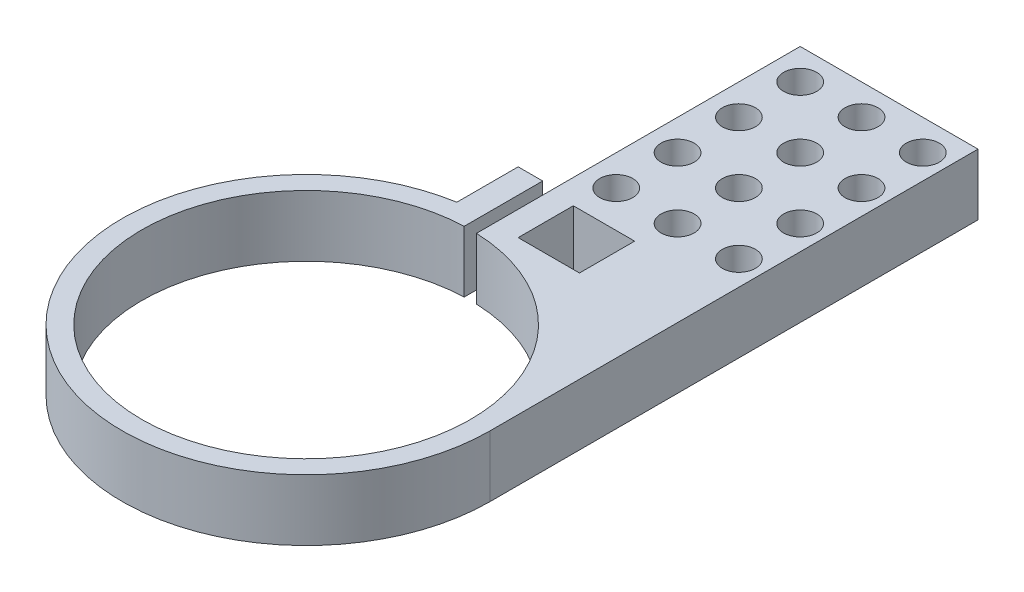
ISO-10303-21;
HEADER;
FILE_DESCRIPTION(('STEP AP214'),'2;1');
FILE_NAME('part.step','',(''),(''),'','','');
FILE_SCHEMA(('AUTOMOTIVE_DESIGN { 1 0 10303 214 1 1 1 1 }'));
ENDSEC;
DATA;
#1=APPLICATION_CONTEXT('core data for automotive mechanical design processes');
#2=APPLICATION_PROTOCOL_DEFINITION('international standard','automotive_design',2000,#1);
#3=PRODUCT_CONTEXT('',#1,'mechanical');
#4=PRODUCT('Part','Part','',(#3));
#5=PRODUCT_RELATED_PRODUCT_CATEGORY('part','',(#4));
#6=PRODUCT_DEFINITION_FORMATION('','',#4);
#7=PRODUCT_DEFINITION_CONTEXT('part definition',#1,'design');
#8=PRODUCT_DEFINITION('design','',#6,#7);
#9=PRODUCT_DEFINITION_SHAPE('','',#8);
#10=(LENGTH_UNIT() NAMED_UNIT(*) SI_UNIT(.MILLI.,.METRE.));
#11=(NAMED_UNIT(*) PLANE_ANGLE_UNIT() SI_UNIT($,.RADIAN.));
#12=(NAMED_UNIT(*) SI_UNIT($,.STERADIAN.) SOLID_ANGLE_UNIT());
#13=UNCERTAINTY_MEASURE_WITH_UNIT(LENGTH_MEASURE(1.E-05),#10,'distance_accuracy_value','');
#14=(GEOMETRIC_REPRESENTATION_CONTEXT(3) GLOBAL_UNCERTAINTY_ASSIGNED_CONTEXT((#13)) GLOBAL_UNIT_ASSIGNED_CONTEXT((#10,
#11,#12)) REPRESENTATION_CONTEXT('',''));
#15=CARTESIAN_POINT('',(0.,0.,0.));
#16=DIRECTION('',(0.,0.,1.));
#17=DIRECTION('',(1.,0.,0.));
#18=AXIS2_PLACEMENT_3D('',#15,#16,#17);
#19=CARTESIAN_POINT('',(0.,12.7,0.));
#20=DIRECTION('',(0.,-1.,0.));
#21=DIRECTION('',(0.,0.,-1.));
#22=AXIS2_PLACEMENT_3D('',#19,#20,#21);
#23=CYLINDRICAL_SURFACE('',#22,38.1);
#24=DIRECTION('',(0.,-1.,0.));
#25=VECTOR('',#24,1.);
#26=CARTESIAN_POINT('',(38.1,12.7,0.));
#27=LINE('',#26,#25);
#28=CARTESIAN_POINT('',(38.1,12.7,0.));
#29=VERTEX_POINT('',#28);
#30=CARTESIAN_POINT('',(38.1,0.,0.));
#31=VERTEX_POINT('',#30);
#32=EDGE_CURVE('E187',#29,#31,#27,.T.);
#33=ORIENTED_EDGE('',*,*,#32,.F.);
#34=CARTESIAN_POINT('',(0.,12.7,0.));
#35=DIRECTION('',(0.,1.,0.));
#36=DIRECTION('',(0.,0.,1.));
#37=AXIS2_PLACEMENT_3D('',#34,#35,#36);
#38=CIRCLE('',#37,38.1);
#39=CARTESIAN_POINT('',(-6.35000000000001,12.7,-37.5671066226826));
#40=VERTEX_POINT('',#39);
#41=EDGE_CURVE('E40',#40,#29,#38,.T.);
#42=ORIENTED_EDGE('',*,*,#41,.F.);
#43=DIRECTION('',(0.,-1.,0.));
#44=VECTOR('',#43,1.);
#45=CARTESIAN_POINT('',(-6.35,12.7,-37.5671066226826));
#46=LINE('',#45,#44);
#47=CARTESIAN_POINT('',(-6.35,0.,-37.5671066226826));
#48=VERTEX_POINT('',#47);
#49=EDGE_CURVE('E217',#40,#48,#46,.T.);
#50=ORIENTED_EDGE('',*,*,#49,.T.);
#51=CARTESIAN_POINT('',(0.,0.,0.));
#52=DIRECTION('',(0.,1.,0.));
#53=DIRECTION('',(0.,0.,1.));
#54=AXIS2_PLACEMENT_3D('',#51,#52,#53);
#55=CIRCLE('',#54,38.1);
#56=EDGE_CURVE('E224',#48,#31,#55,.T.);
#57=ORIENTED_EDGE('',*,*,#56,.T.);
#58=EDGE_LOOP('',(#33,#42,#50,#57));
#59=FACE_BOUND('',#58,.T.);
#60=ADVANCED_FACE('F33',(#59),#23,.T.);
#61=CARTESIAN_POINT('',(0.,12.7,0.));
#62=DIRECTION('',(0.,1.,0.));
#63=DIRECTION('',(0.,0.,1.));
#64=AXIS2_PLACEMENT_3D('',#61,#62,#63);
#65=PLANE('',#64);
#66=CARTESIAN_POINT('',(20.3200000000003,12.7,-69.3171066226826));
#67=DIRECTION('',(0.,1.,0.));
#68=DIRECTION('',(0.,0.,1.));
#69=AXIS2_PLACEMENT_3D('',#66,#67,#68);
#70=CIRCLE('',#69,3.42900000000002);
#71=CARTESIAN_POINT('',(20.3200000000003,12.7,-65.8881066226825));
#72=VERTEX_POINT('',#71);
#73=EDGE_CURVE('E500',#72,#72,#70,.T.);
#74=ORIENTED_EDGE('',*,*,#73,.F.);
#75=EDGE_LOOP('',(#74));
#76=FACE_BOUND('',#75,.T.);
#77=CARTESIAN_POINT('',(7.62000000000027,12.7,-69.3171066226826));
#78=DIRECTION('',(0.,1.,0.));
#79=DIRECTION('',(0.,0.,1.));
#80=AXIS2_PLACEMENT_3D('',#77,#78,#79);
#81=CIRCLE('',#80,3.42900000000001);
#82=CARTESIAN_POINT('',(7.62000000000027,12.7,-65.8881066226825));
#83=VERTEX_POINT('',#82);
#84=EDGE_CURVE('E541',#83,#83,#81,.T.);
#85=ORIENTED_EDGE('',*,*,#84,.F.);
#86=EDGE_LOOP('',(#85));
#87=FACE_BOUND('',#86,.T.);
#88=CARTESIAN_POINT('',(33.0200000000001,12.7,-82.0171066226826));
#89=DIRECTION('',(0.,1.,0.));
#90=DIRECTION('',(0.,0.,1.));
#91=AXIS2_PLACEMENT_3D('',#88,#89,#90);
#92=CIRCLE('',#91,3.42900000000001);
#93=CARTESIAN_POINT('',(33.0200000000001,12.7,-78.5881066226825));
#94=VERTEX_POINT('',#93);
#95=EDGE_CURVE('E530',#94,#94,#92,.T.);
#96=ORIENTED_EDGE('',*,*,#95,.F.);
#97=EDGE_LOOP('',(#96));
#98=FACE_BOUND('',#97,.T.);
#99=CARTESIAN_POINT('',(33.02,12.7,-94.7171066226826));
#100=DIRECTION('',(0.,1.,0.));
#101=DIRECTION('',(0.,0.,1.));
#102=AXIS2_PLACEMENT_3D('',#99,#100,#101);
#103=CIRCLE('',#102,3.42900000000001);
#104=CARTESIAN_POINT('',(33.02,12.7,-91.2881066226826));
#105=VERTEX_POINT('',#104);
#106=EDGE_CURVE('E522',#105,#105,#103,.T.);
#107=ORIENTED_EDGE('',*,*,#106,.F.);
#108=EDGE_LOOP('',(#107));
#109=FACE_BOUND('',#108,.T.);
#110=DIRECTION('',(1.,0.,0.));
#111=VECTOR('',#110,1.);
#112=CARTESIAN_POINT('',(6.35,12.7,-37.5671066226826));
#113=LINE('',#112,#111);
#114=CARTESIAN_POINT('',(6.35,12.7,-37.5671066226826));
#115=VERTEX_POINT('',#114);
#116=CARTESIAN_POINT('',(19.05,12.7,-37.5671066226826));
#117=VERTEX_POINT('',#116);
#118=EDGE_CURVE('E128',#115,#117,#113,.T.);
#119=ORIENTED_EDGE('',*,*,#118,.F.);
#120=DIRECTION('',(0.,0.,1.));
#121=VECTOR('',#120,1.);
#122=CARTESIAN_POINT('',(6.35,12.7,-48.9971066226826));
#123=LINE('',#122,#121);
#124=CARTESIAN_POINT('',(6.35,12.7,-48.9971066226826));
#125=VERTEX_POINT('',#124);
#126=EDGE_CURVE('E120',#125,#115,#123,.T.);
#127=ORIENTED_EDGE('',*,*,#126,.F.);
#128=DIRECTION('',(-1.,0.,0.));
#129=VECTOR('',#128,1.);
#130=CARTESIAN_POINT('',(6.35,12.7,-48.9971066226826));
#131=LINE('',#130,#129);
#132=CARTESIAN_POINT('',(19.05,12.7,-48.9971066226826));
#133=VERTEX_POINT('',#132);
#134=EDGE_CURVE('E144',#133,#125,#131,.T.);
#135=ORIENTED_EDGE('',*,*,#134,.F.);
#136=DIRECTION('',(0.,0.,-1.));
#137=VECTOR('',#136,1.);
#138=CARTESIAN_POINT('',(19.05,12.7,-48.9971066226826));
#139=LINE('',#138,#137);
#140=EDGE_CURVE('E142',#117,#133,#139,.T.);
#141=ORIENTED_EDGE('',*,*,#140,.F.);
#142=EDGE_LOOP('',(#119,#127,#135,#141));
#143=FACE_BOUND('',#142,.T.);
#144=CARTESIAN_POINT('',(20.32,12.7,-94.7171066226826));
#145=DIRECTION('',(0.,1.,0.));
#146=DIRECTION('',(0.,0.,1.));
#147=AXIS2_PLACEMENT_3D('',#144,#145,#146);
#148=CIRCLE('',#147,3.42900000000002);
#149=CARTESIAN_POINT('',(20.32,12.7,-91.2881066226825));
#150=VERTEX_POINT('',#149);
#151=EDGE_CURVE('E150',#150,#150,#148,.T.);
#152=ORIENTED_EDGE('',*,*,#151,.F.);
#153=EDGE_LOOP('',(#152));
#154=FACE_BOUND('',#153,.T.);
#155=CARTESIAN_POINT('',(20.3200000000001,12.7,-82.0171066226826));
#156=DIRECTION('',(0.,1.,0.));
#157=DIRECTION('',(0.,0.,1.));
#158=AXIS2_PLACEMENT_3D('',#155,#156,#157);
#159=CIRCLE('',#158,3.42900000000002);
#160=CARTESIAN_POINT('',(20.3200000000001,12.7,-78.5881066226825));
#161=VERTEX_POINT('',#160);
#162=EDGE_CURVE('E165',#161,#161,#159,.T.);
#163=ORIENTED_EDGE('',*,*,#162,.F.);
#164=EDGE_LOOP('',(#163));
#165=FACE_BOUND('',#164,.T.);
#166=CARTESIAN_POINT('',(7.62000000000013,12.7,-82.0171066226826));
#167=DIRECTION('',(0.,1.,0.));
#168=DIRECTION('',(0.,0.,1.));
#169=AXIS2_PLACEMENT_3D('',#166,#167,#168);
#170=CIRCLE('',#169,3.42900000000001);
#171=CARTESIAN_POINT('',(7.62000000000013,12.7,-78.5881066226825));
#172=VERTEX_POINT('',#171);
#173=EDGE_CURVE('E518',#172,#172,#170,.T.);
#174=ORIENTED_EDGE('',*,*,#173,.F.);
#175=EDGE_LOOP('',(#174));
#176=FACE_BOUND('',#175,.T.);
#177=CARTESIAN_POINT('',(33.0200000000004,12.7,-56.6171066226826));
#178=DIRECTION('',(0.,1.,0.));
#179=DIRECTION('',(0.,0.,1.));
#180=AXIS2_PLACEMENT_3D('',#177,#178,#179);
#181=CIRCLE('',#180,3.42900000000001);
#182=CARTESIAN_POINT('',(33.0200000000004,12.7,-53.1881066226826));
#183=VERTEX_POINT('',#182);
#184=EDGE_CURVE('E579',#183,#183,#181,.T.);
#185=ORIENTED_EDGE('',*,*,#184,.F.);
#186=EDGE_LOOP('',(#185));
#187=FACE_BOUND('',#186,.T.);
#188=CARTESIAN_POINT('',(20.3200000000004,12.7,-56.6171066226826));
#189=DIRECTION('',(0.,1.,0.));
#190=DIRECTION('',(0.,0.,1.));
#191=AXIS2_PLACEMENT_3D('',#188,#189,#190);
#192=CIRCLE('',#191,3.42900000000001);
#193=CARTESIAN_POINT('',(20.3200000000004,12.7,-53.1881066226826));
#194=VERTEX_POINT('',#193);
#195=EDGE_CURVE('E583',#194,#194,#192,.T.);
#196=ORIENTED_EDGE('',*,*,#195,.F.);
#197=EDGE_LOOP('',(#196));
#198=FACE_BOUND('',#197,.T.);
#199=CARTESIAN_POINT('',(7.6200000000004,12.7,-56.6171066226826));
#200=DIRECTION('',(0.,1.,0.));
#201=DIRECTION('',(0.,0.,1.));
#202=AXIS2_PLACEMENT_3D('',#199,#200,#201);
#203=CIRCLE('',#202,3.42900000000001);
#204=CARTESIAN_POINT('',(7.6200000000004,12.7,-53.1881066226826));
#205=VERTEX_POINT('',#204);
#206=EDGE_CURVE('E574',#205,#205,#203,.T.);
#207=ORIENTED_EDGE('',*,*,#206,.F.);
#208=EDGE_LOOP('',(#207));
#209=FACE_BOUND('',#208,.T.);
#210=CARTESIAN_POINT('',(33.0200000000003,12.7,-69.3171066226826));
#211=DIRECTION('',(0.,1.,0.));
#212=DIRECTION('',(0.,0.,1.));
#213=AXIS2_PLACEMENT_3D('',#210,#211,#212);
#214=CIRCLE('',#213,3.42900000000001);
#215=CARTESIAN_POINT('',(33.0200000000003,12.7,-65.8881066226826));
#216=VERTEX_POINT('',#215);
#217=EDGE_CURVE('E504',#216,#216,#214,.T.);
#218=ORIENTED_EDGE('',*,*,#217,.F.);
#219=EDGE_LOOP('',(#218));
#220=FACE_BOUND('',#219,.T.);
#221=CARTESIAN_POINT('',(7.62,12.7,-94.7171066226826));
#222=DIRECTION('',(0.,1.,0.));
#223=DIRECTION('',(0.,0.,1.));
#224=AXIS2_PLACEMENT_3D('',#221,#222,#223);
#225=CIRCLE('',#224,3.42900000000001);
#226=CARTESIAN_POINT('',(7.62,12.7,-91.2881066226825));
#227=VERTEX_POINT('',#226);
#228=EDGE_CURVE('E166',#227,#227,#225,.T.);
#229=ORIENTED_EDGE('',*,*,#228,.F.);
#230=EDGE_LOOP('',(#229));
#231=FACE_BOUND('',#230,.T.);
#232=ORIENTED_EDGE('',*,*,#41,.T.);
#233=DIRECTION('',(0.,0.,1.));
#234=VECTOR('',#233,1.);
#235=CARTESIAN_POINT('',(38.1,12.7,-50.2671066226826));
#236=LINE('',#235,#234);
#237=CARTESIAN_POINT('',(38.1,12.7,-101.067106622683));
#238=VERTEX_POINT('',#237);
#239=EDGE_CURVE('E181',#238,#29,#236,.T.);
#240=ORIENTED_EDGE('',*,*,#239,.F.);
#241=DIRECTION('',(-1.,0.,0.));
#242=VECTOR('',#241,1.);
#243=CARTESIAN_POINT('',(38.1,12.7,-101.067106622683));
#244=LINE('',#243,#242);
#245=CARTESIAN_POINT('',(1.27,12.7,-101.067106622683));
#246=VERTEX_POINT('',#245);
#247=EDGE_CURVE('E169',#238,#246,#244,.T.);
#248=ORIENTED_EDGE('',*,*,#247,.T.);
#249=DIRECTION('',(0.,0.,-1.));
#250=VECTOR('',#249,1.);
#251=CARTESIAN_POINT('',(1.27,12.7,2.48830381544174));
#252=LINE('',#251,#250);
#253=CARTESIAN_POINT('',(1.27,12.7,-34.0122977171493));
#254=VERTEX_POINT('',#253);
#255=EDGE_CURVE('E190',#254,#246,#252,.T.);
#256=ORIENTED_EDGE('',*,*,#255,.F.);
#257=CARTESIAN_POINT('',(0.,12.7,0.));
#258=DIRECTION('',(0.,1.,0.));
#259=DIRECTION('',(0.,0.,1.));
#260=AXIS2_PLACEMENT_3D('',#257,#258,#259);
#261=CIRCLE('',#260,34.036);
#262=CARTESIAN_POINT('',(-1.27,12.7,-34.0122977171493));
#263=VERTEX_POINT('',#262);
#264=EDGE_CURVE('E221',#263,#254,#261,.T.);
#265=ORIENTED_EDGE('',*,*,#264,.F.);
#266=DIRECTION('',(0.,0.,1.));
#267=VECTOR('',#266,1.);
#268=CARTESIAN_POINT('',(-1.27,12.7,2.48830381544174));
#269=LINE('',#268,#267);
#270=CARTESIAN_POINT('',(-1.27,12.7,-50.2671066226826));
#271=VERTEX_POINT('',#270);
#272=EDGE_CURVE('E192',#271,#263,#269,.T.);
#273=ORIENTED_EDGE('',*,*,#272,.F.);
#274=DIRECTION('',(-1.,0.,0.));
#275=VECTOR('',#274,1.);
#276=CARTESIAN_POINT('',(6.35,12.7,-50.2671066226826));
#277=LINE('',#276,#275);
#278=CARTESIAN_POINT('',(-6.35,12.7,-50.2671066226826));
#279=VERTEX_POINT('',#278);
#280=EDGE_CURVE('E208',#271,#279,#277,.T.);
#281=ORIENTED_EDGE('',*,*,#280,.T.);
#282=DIRECTION('',(0.,0.,1.));
#283=VECTOR('',#282,1.);
#284=CARTESIAN_POINT('',(-6.35,12.7,-50.2671066226826));
#285=LINE('',#284,#283);
#286=EDGE_CURVE('E205',#279,#40,#285,.T.);
#287=ORIENTED_EDGE('',*,*,#286,.T.);
#288=EDGE_LOOP('',(#232,#240,#248,#256,#265,#273,#281,#287));
#289=FACE_BOUND('',#288,.T.);
#290=ADVANCED_FACE('F140',(#76,#87,#98,#109,#143,#154,#165,#176,#187,#198,#209,#220,#231,#289),
#65,.T.);
#291=CARTESIAN_POINT('',(0.,0.,0.));
#292=DIRECTION('',(0.,1.,0.));
#293=DIRECTION('',(0.,0.,1.));
#294=AXIS2_PLACEMENT_3D('',#291,#292,#293);
#295=PLANE('',#294);
#296=CARTESIAN_POINT('',(20.3200000000003,0.,-69.3171066226826));
#297=DIRECTION('',(0.,1.,0.));
#298=DIRECTION('',(0.,0.,1.));
#299=AXIS2_PLACEMENT_3D('',#296,#297,#298);
#300=CIRCLE('',#299,3.42900000000002);
#301=CARTESIAN_POINT('',(20.3200000000003,0.,-65.8881066226825));
#302=VERTEX_POINT('',#301);
#303=EDGE_CURVE('E503',#302,#302,#300,.T.);
#304=ORIENTED_EDGE('',*,*,#303,.T.);
#305=EDGE_LOOP('',(#304));
#306=FACE_BOUND('',#305,.T.);
#307=CARTESIAN_POINT('',(7.62000000000027,0.,-69.3171066226826));
#308=DIRECTION('',(0.,1.,0.));
#309=DIRECTION('',(0.,0.,1.));
#310=AXIS2_PLACEMENT_3D('',#307,#308,#309);
#311=CIRCLE('',#310,3.42900000000001);
#312=CARTESIAN_POINT('',(7.62000000000027,0.,-65.8881066226825));
#313=VERTEX_POINT('',#312);
#314=EDGE_CURVE('E506',#313,#313,#311,.T.);
#315=ORIENTED_EDGE('',*,*,#314,.T.);
#316=EDGE_LOOP('',(#315));
#317=FACE_BOUND('',#316,.T.);
#318=CARTESIAN_POINT('',(33.0200000000001,0.,-82.0171066226826));
#319=DIRECTION('',(0.,1.,0.));
#320=DIRECTION('',(0.,0.,1.));
#321=AXIS2_PLACEMENT_3D('',#318,#319,#320);
#322=CIRCLE('',#321,3.42900000000001);
#323=CARTESIAN_POINT('',(33.0200000000001,0.,-78.5881066226825));
#324=VERTEX_POINT('',#323);
#325=EDGE_CURVE('E538',#324,#324,#322,.T.);
#326=ORIENTED_EDGE('',*,*,#325,.T.);
#327=EDGE_LOOP('',(#326));
#328=FACE_BOUND('',#327,.T.);
#329=CARTESIAN_POINT('',(33.02,0.,-94.7171066226826));
#330=DIRECTION('',(0.,1.,0.));
#331=DIRECTION('',(0.,0.,1.));
#332=AXIS2_PLACEMENT_3D('',#329,#330,#331);
#333=CIRCLE('',#332,3.42900000000001);
#334=CARTESIAN_POINT('',(33.02,0.,-91.2881066226826));
#335=VERTEX_POINT('',#334);
#336=EDGE_CURVE('E526',#335,#335,#333,.T.);
#337=ORIENTED_EDGE('',*,*,#336,.T.);
#338=EDGE_LOOP('',(#337));
#339=FACE_BOUND('',#338,.T.);
#340=DIRECTION('',(0.,0.,1.));
#341=VECTOR('',#340,1.);
#342=CARTESIAN_POINT('',(6.35,0.,-48.9971066226826));
#343=LINE('',#342,#341);
#344=CARTESIAN_POINT('',(6.35,0.,-48.9971066226826));
#345=VERTEX_POINT('',#344);
#346=CARTESIAN_POINT('',(6.35,0.,-37.5671066226826));
#347=VERTEX_POINT('',#346);
#348=EDGE_CURVE('E55',#345,#347,#343,.T.);
#349=ORIENTED_EDGE('',*,*,#348,.T.);
#350=DIRECTION('',(1.,0.,0.));
#351=VECTOR('',#350,1.);
#352=CARTESIAN_POINT('',(6.35,0.,-37.5671066226826));
#353=LINE('',#352,#351);
#354=CARTESIAN_POINT('',(19.05,0.,-37.5671066226826));
#355=VERTEX_POINT('',#354);
#356=EDGE_CURVE('E135',#347,#355,#353,.T.);
#357=ORIENTED_EDGE('',*,*,#356,.T.);
#358=DIRECTION('',(0.,0.,-1.));
#359=VECTOR('',#358,1.);
#360=CARTESIAN_POINT('',(19.05,0.,-48.9971066226826));
#361=LINE('',#360,#359);
#362=CARTESIAN_POINT('',(19.05,0.,-48.9971066226826));
#363=VERTEX_POINT('',#362);
#364=EDGE_CURVE('E152',#355,#363,#361,.T.);
#365=ORIENTED_EDGE('',*,*,#364,.T.);
#366=DIRECTION('',(-1.,0.,0.));
#367=VECTOR('',#366,1.);
#368=CARTESIAN_POINT('',(6.35,0.,-48.9971066226826));
#369=LINE('',#368,#367);
#370=EDGE_CURVE('E129',#363,#345,#369,.T.);
#371=ORIENTED_EDGE('',*,*,#370,.T.);
#372=EDGE_LOOP('',(#349,#357,#365,#371));
#373=FACE_BOUND('',#372,.T.);
#374=CARTESIAN_POINT('',(20.32,0.,-94.7171066226826));
#375=DIRECTION('',(0.,1.,0.));
#376=DIRECTION('',(0.,0.,1.));
#377=AXIS2_PLACEMENT_3D('',#374,#375,#376);
#378=CIRCLE('',#377,3.42900000000002);
#379=CARTESIAN_POINT('',(20.32,0.,-91.2881066226825));
#380=VERTEX_POINT('',#379);
#381=EDGE_CURVE('E162',#380,#380,#378,.T.);
#382=ORIENTED_EDGE('',*,*,#381,.T.);
#383=EDGE_LOOP('',(#382));
#384=FACE_BOUND('',#383,.T.);
#385=CARTESIAN_POINT('',(20.3200000000001,0.,-82.0171066226826));
#386=DIRECTION('',(0.,1.,0.));
#387=DIRECTION('',(0.,0.,1.));
#388=AXIS2_PLACEMENT_3D('',#385,#386,#387);
#389=CIRCLE('',#388,3.42900000000002);
#390=CARTESIAN_POINT('',(20.3200000000001,0.,-78.5881066226825));
#391=VERTEX_POINT('',#390);
#392=EDGE_CURVE('E515',#391,#391,#389,.T.);
#393=ORIENTED_EDGE('',*,*,#392,.T.);
#394=EDGE_LOOP('',(#393));
#395=FACE_BOUND('',#394,.T.);
#396=CARTESIAN_POINT('',(7.62000000000013,0.,-82.0171066226826));
#397=DIRECTION('',(0.,1.,0.));
#398=DIRECTION('',(0.,0.,1.));
#399=AXIS2_PLACEMENT_3D('',#396,#397,#398);
#400=CIRCLE('',#399,3.42900000000001);
#401=CARTESIAN_POINT('',(7.62000000000013,0.,-78.5881066226825));
#402=VERTEX_POINT('',#401);
#403=EDGE_CURVE('E520',#402,#402,#400,.T.);
#404=ORIENTED_EDGE('',*,*,#403,.T.);
#405=EDGE_LOOP('',(#404));
#406=FACE_BOUND('',#405,.T.);
#407=CARTESIAN_POINT('',(33.0200000000004,0.,-56.6171066226826));
#408=DIRECTION('',(0.,1.,0.));
#409=DIRECTION('',(0.,0.,1.));
#410=AXIS2_PLACEMENT_3D('',#407,#408,#409);
#411=CIRCLE('',#410,3.42900000000001);
#412=CARTESIAN_POINT('',(33.0200000000004,0.,-53.1881066226826));
#413=VERTEX_POINT('',#412);
#414=EDGE_CURVE('E560',#413,#413,#411,.T.);
#415=ORIENTED_EDGE('',*,*,#414,.T.);
#416=EDGE_LOOP('',(#415));
#417=FACE_BOUND('',#416,.T.);
#418=CARTESIAN_POINT('',(20.3200000000004,0.,-56.6171066226826));
#419=DIRECTION('',(0.,1.,0.));
#420=DIRECTION('',(0.,0.,1.));
#421=AXIS2_PLACEMENT_3D('',#418,#419,#420);
#422=CIRCLE('',#421,3.42900000000001);
#423=CARTESIAN_POINT('',(20.3200000000004,0.,-53.1881066226826));
#424=VERTEX_POINT('',#423);
#425=EDGE_CURVE('E564',#424,#424,#422,.T.);
#426=ORIENTED_EDGE('',*,*,#425,.T.);
#427=EDGE_LOOP('',(#426));
#428=FACE_BOUND('',#427,.T.);
#429=CARTESIAN_POINT('',(7.6200000000004,0.,-56.6171066226826));
#430=DIRECTION('',(0.,1.,0.));
#431=DIRECTION('',(0.,0.,1.));
#432=AXIS2_PLACEMENT_3D('',#429,#430,#431);
#433=CIRCLE('',#432,3.42900000000001);
#434=CARTESIAN_POINT('',(7.6200000000004,0.,-53.1881066226826));
#435=VERTEX_POINT('',#434);
#436=EDGE_CURVE('E533',#435,#435,#433,.T.);
#437=ORIENTED_EDGE('',*,*,#436,.T.);
#438=EDGE_LOOP('',(#437));
#439=FACE_BOUND('',#438,.T.);
#440=CARTESIAN_POINT('',(33.0200000000003,0.,-69.3171066226826));
#441=DIRECTION('',(0.,1.,0.));
#442=DIRECTION('',(0.,0.,1.));
#443=AXIS2_PLACEMENT_3D('',#440,#441,#442);
#444=CIRCLE('',#443,3.42900000000001);
#445=CARTESIAN_POINT('',(33.0200000000003,0.,-65.8881066226826));
#446=VERTEX_POINT('',#445);
#447=EDGE_CURVE('E509',#446,#446,#444,.T.);
#448=ORIENTED_EDGE('',*,*,#447,.T.);
#449=EDGE_LOOP('',(#448));
#450=FACE_BOUND('',#449,.T.);
#451=CARTESIAN_POINT('',(7.62,0.,-94.7171066226826));
#452=DIRECTION('',(0.,1.,0.));
#453=DIRECTION('',(0.,0.,1.));
#454=AXIS2_PLACEMENT_3D('',#451,#452,#453);
#455=CIRCLE('',#454,3.42900000000001);
#456=CARTESIAN_POINT('',(7.62,0.,-91.2881066226825));
#457=VERTEX_POINT('',#456);
#458=EDGE_CURVE('E136',#457,#457,#455,.T.);
#459=ORIENTED_EDGE('',*,*,#458,.T.);
#460=EDGE_LOOP('',(#459));
#461=FACE_BOUND('',#460,.T.);
#462=DIRECTION('',(0.,0.,-1.));
#463=VECTOR('',#462,1.);
#464=CARTESIAN_POINT('',(1.27,0.,2.48830381544174));
#465=LINE('',#464,#463);
#466=CARTESIAN_POINT('',(1.27,0.,-34.0122977171493));
#467=VERTEX_POINT('',#466);
#468=CARTESIAN_POINT('',(1.27,0.,-101.067106622683));
#469=VERTEX_POINT('',#468);
#470=EDGE_CURVE('E186',#467,#469,#465,.T.);
#471=ORIENTED_EDGE('',*,*,#470,.T.);
#472=DIRECTION('',(-1.,0.,0.));
#473=VECTOR('',#472,1.);
#474=CARTESIAN_POINT('',(38.1,0.,-101.067106622683));
#475=LINE('',#474,#473);
#476=CARTESIAN_POINT('',(38.1,0.,-101.067106622683));
#477=VERTEX_POINT('',#476);
#478=EDGE_CURVE('E172',#477,#469,#475,.T.);
#479=ORIENTED_EDGE('',*,*,#478,.F.);
#480=DIRECTION('',(0.,0.,-1.));
#481=VECTOR('',#480,1.);
#482=CARTESIAN_POINT('',(38.1,0.,-50.2671066226826));
#483=LINE('',#482,#481);
#484=EDGE_CURVE('E184',#31,#477,#483,.T.);
#485=ORIENTED_EDGE('',*,*,#484,.F.);
#486=ORIENTED_EDGE('',*,*,#56,.F.);
#487=DIRECTION('',(0.,0.,1.));
#488=VECTOR('',#487,1.);
#489=CARTESIAN_POINT('',(-6.35,0.,-50.2671066226826));
#490=LINE('',#489,#488);
#491=CARTESIAN_POINT('',(-6.35,0.,-50.2671066226826));
#492=VERTEX_POINT('',#491);
#493=EDGE_CURVE('E204',#492,#48,#490,.T.);
#494=ORIENTED_EDGE('',*,*,#493,.F.);
#495=DIRECTION('',(-1.,0.,0.));
#496=VECTOR('',#495,1.);
#497=CARTESIAN_POINT('',(6.35,0.,-50.2671066226826));
#498=LINE('',#497,#496);
#499=CARTESIAN_POINT('',(-1.27,0.,-50.2671066226826));
#500=VERTEX_POINT('',#499);
#501=EDGE_CURVE('E209',#500,#492,#498,.T.);
#502=ORIENTED_EDGE('',*,*,#501,.F.);
#503=DIRECTION('',(0.,0.,1.));
#504=VECTOR('',#503,1.);
#505=CARTESIAN_POINT('',(-1.27,0.,2.48830381544174));
#506=LINE('',#505,#504);
#507=CARTESIAN_POINT('',(-1.27,0.,-34.0122977171493));
#508=VERTEX_POINT('',#507);
#509=EDGE_CURVE('E193',#500,#508,#506,.T.);
#510=ORIENTED_EDGE('',*,*,#509,.T.);
#511=CARTESIAN_POINT('',(0.,0.,0.));
#512=DIRECTION('',(0.,1.,0.));
#513=DIRECTION('',(0.,0.,1.));
#514=AXIS2_PLACEMENT_3D('',#511,#512,#513);
#515=CIRCLE('',#514,34.036);
#516=EDGE_CURVE('E220',#508,#467,#515,.T.);
#517=ORIENTED_EDGE('',*,*,#516,.T.);
#518=EDGE_LOOP('',(#471,#479,#485,#486,#494,#502,#510,#517));
#519=FACE_BOUND('',#518,.T.);
#520=ADVANCED_FACE('F235',(#306,#317,#328,#339,#373,#384,#395,#406,#417,#428,#439,#450,#461,
#519),#295,.F.);
#521=CARTESIAN_POINT('',(0.,12.7,0.));
#522=DIRECTION('',(0.,-1.,0.));
#523=DIRECTION('',(0.,0.,-1.));
#524=AXIS2_PLACEMENT_3D('',#521,#522,#523);
#525=CYLINDRICAL_SURFACE('',#524,34.036);
#526=ORIENTED_EDGE('',*,*,#264,.T.);
#527=DIRECTION('',(0.,-1.,0.));
#528=VECTOR('',#527,1.);
#529=CARTESIAN_POINT('',(1.27,12.7,-34.0122977171493));
#530=LINE('',#529,#528);
#531=EDGE_CURVE('E201',#254,#467,#530,.T.);
#532=ORIENTED_EDGE('',*,*,#531,.T.);
#533=ORIENTED_EDGE('',*,*,#516,.F.);
#534=DIRECTION('',(0.,-1.,0.));
#535=VECTOR('',#534,1.);
#536=CARTESIAN_POINT('',(-1.27,12.7,-34.0122977171493));
#537=LINE('',#536,#535);
#538=EDGE_CURVE('E195',#508,#263,#537,.F.);
#539=ORIENTED_EDGE('',*,*,#538,.T.);
#540=EDGE_LOOP('',(#526,#532,#533,#539));
#541=FACE_BOUND('',#540,.T.);
#542=ADVANCED_FACE('F260',(#541),#525,.F.);
#543=CARTESIAN_POINT('',(6.35,12.7,-50.2671066226826));
#544=DIRECTION('',(0.,0.,1.));
#545=DIRECTION('',(1.,0.,0.));
#546=AXIS2_PLACEMENT_3D('',#543,#544,#545);
#547=PLANE('',#546);
#548=DIRECTION('',(0.,1.,0.));
#549=VECTOR('',#548,1.);
#550=CARTESIAN_POINT('',(-1.27,12.7,-50.2671066226826));
#551=LINE('',#550,#549);
#552=EDGE_CURVE('E11',#500,#271,#551,.T.);
#553=ORIENTED_EDGE('',*,*,#552,.F.);
#554=ORIENTED_EDGE('',*,*,#501,.T.);
#555=DIRECTION('',(0.,-1.,0.));
#556=VECTOR('',#555,1.);
#557=CARTESIAN_POINT('',(-6.35,12.7,-50.2671066226826));
#558=LINE('',#557,#556);
#559=EDGE_CURVE('E211',#279,#492,#558,.T.);
#560=ORIENTED_EDGE('',*,*,#559,.F.);
#561=ORIENTED_EDGE('',*,*,#280,.F.);
#562=EDGE_LOOP('',(#553,#554,#560,#561));
#563=FACE_BOUND('',#562,.T.);
#564=ADVANCED_FACE('F256',(#563),#547,.F.);
#565=CARTESIAN_POINT('',(-6.35,12.7,-50.2671066226826));
#566=DIRECTION('',(1.,0.,0.));
#567=DIRECTION('',(0.,0.,-1.));
#568=AXIS2_PLACEMENT_3D('',#565,#566,#567);
#569=PLANE('',#568);
#570=ORIENTED_EDGE('',*,*,#493,.T.);
#571=ORIENTED_EDGE('',*,*,#49,.F.);
#572=ORIENTED_EDGE('',*,*,#286,.F.);
#573=ORIENTED_EDGE('',*,*,#559,.T.);
#574=EDGE_LOOP('',(#570,#571,#572,#573));
#575=FACE_BOUND('',#574,.T.);
#576=ADVANCED_FACE('F253',(#575),#569,.F.);
#577=CARTESIAN_POINT('',(-1.27,12.7,2.48830381544174));
#578=DIRECTION('',(1.,0.,0.));
#579=DIRECTION('',(0.,0.,-1.));
#580=AXIS2_PLACEMENT_3D('',#577,#578,#579);
#581=PLANE('',#580);
#582=ORIENTED_EDGE('',*,*,#509,.F.);
#583=ORIENTED_EDGE('',*,*,#552,.T.);
#584=ORIENTED_EDGE('',*,*,#272,.T.);
#585=ORIENTED_EDGE('',*,*,#538,.F.);
#586=EDGE_LOOP('',(#582,#583,#584,#585));
#587=FACE_BOUND('',#586,.T.);
#588=ADVANCED_FACE('F264',(#587),#581,.T.);
#589=CARTESIAN_POINT('',(1.27,12.7,2.48830381544174));
#590=DIRECTION('',(-1.,0.,0.));
#591=DIRECTION('',(0.,0.,1.));
#592=AXIS2_PLACEMENT_3D('',#589,#590,#591);
#593=PLANE('',#592);
#594=ORIENTED_EDGE('',*,*,#255,.T.);
#595=DIRECTION('',(0.,1.,0.));
#596=VECTOR('',#595,1.);
#597=CARTESIAN_POINT('',(1.27,0.,-101.067106622683));
#598=LINE('',#597,#596);
#599=EDGE_CURVE('E178',#469,#246,#598,.T.);
#600=ORIENTED_EDGE('',*,*,#599,.F.);
#601=ORIENTED_EDGE('',*,*,#470,.F.);
#602=ORIENTED_EDGE('',*,*,#531,.F.);
#603=EDGE_LOOP('',(#594,#600,#601,#602));
#604=FACE_BOUND('',#603,.T.);
#605=ADVANCED_FACE('F262',(#604),#593,.T.);
#606=CARTESIAN_POINT('',(38.1,0.,0.));
#607=DIRECTION('',(-1.,0.,0.));
#608=DIRECTION('',(0.,0.,1.));
#609=AXIS2_PLACEMENT_3D('',#606,#607,#608);
#610=PLANE('',#609);
#611=ORIENTED_EDGE('',*,*,#484,.T.);
#612=DIRECTION('',(0.,1.,0.));
#613=VECTOR('',#612,1.);
#614=CARTESIAN_POINT('',(38.1,0.,-101.067106622683));
#615=LINE('',#614,#613);
#616=EDGE_CURVE('E175',#477,#238,#615,.T.);
#617=ORIENTED_EDGE('',*,*,#616,.T.);
#618=ORIENTED_EDGE('',*,*,#239,.T.);
#619=ORIENTED_EDGE('',*,*,#32,.T.);
#620=EDGE_LOOP('',(#611,#617,#618,#619));
#621=FACE_BOUND('',#620,.T.);
#622=ADVANCED_FACE('F240',(#621),#610,.F.);
#623=CARTESIAN_POINT('',(38.1,0.,-101.067106622683));
#624=DIRECTION('',(0.,0.,-1.));
#625=DIRECTION('',(-1.,0.,0.));
#626=AXIS2_PLACEMENT_3D('',#623,#624,#625);
#627=PLANE('',#626);
#628=ORIENTED_EDGE('',*,*,#247,.F.);
#629=ORIENTED_EDGE('',*,*,#616,.F.);
#630=ORIENTED_EDGE('',*,*,#478,.T.);
#631=ORIENTED_EDGE('',*,*,#599,.T.);
#632=EDGE_LOOP('',(#628,#629,#630,#631));
#633=FACE_BOUND('',#632,.T.);
#634=ADVANCED_FACE('F243',(#633),#627,.T.);
#635=CARTESIAN_POINT('',(7.62,12.7,-94.7171066226826));
#636=DIRECTION('',(0.,-1.,0.));
#637=DIRECTION('',(0.,0.,-1.));
#638=AXIS2_PLACEMENT_3D('',#635,#636,#637);
#639=CYLINDRICAL_SURFACE('',#638,3.42900000000001);
#640=ORIENTED_EDGE('',*,*,#228,.T.);
#641=EDGE_LOOP('',(#640));
#642=FACE_BOUND('',#641,.T.);
#643=ORIENTED_EDGE('',*,*,#458,.F.);
#644=EDGE_LOOP('',(#643));
#645=FACE_BOUND('',#644,.T.);
#646=ADVANCED_FACE('F329',(#642,#645),#639,.F.);
#647=CARTESIAN_POINT('',(33.0200000000003,12.7,-69.3171066226826));
#648=DIRECTION('',(0.,-1.,0.));
#649=DIRECTION('',(0.,0.,-1.));
#650=AXIS2_PLACEMENT_3D('',#647,#648,#649);
#651=CYLINDRICAL_SURFACE('',#650,3.42900000000001);
#652=ORIENTED_EDGE('',*,*,#217,.T.);
#653=EDGE_LOOP('',(#652));
#654=FACE_BOUND('',#653,.T.);
#655=ORIENTED_EDGE('',*,*,#447,.F.);
#656=EDGE_LOOP('',(#655));
#657=FACE_BOUND('',#656,.T.);
#658=ADVANCED_FACE('F349',(#654,#657),#651,.F.);
#659=CARTESIAN_POINT('',(7.6200000000004,12.7,-56.6171066226826));
#660=DIRECTION('',(0.,-1.,0.));
#661=DIRECTION('',(0.,0.,-1.));
#662=AXIS2_PLACEMENT_3D('',#659,#660,#661);
#663=CYLINDRICAL_SURFACE('',#662,3.42900000000001);
#664=ORIENTED_EDGE('',*,*,#206,.T.);
#665=EDGE_LOOP('',(#664));
#666=FACE_BOUND('',#665,.T.);
#667=ORIENTED_EDGE('',*,*,#436,.F.);
#668=EDGE_LOOP('',(#667));
#669=FACE_BOUND('',#668,.T.);
#670=ADVANCED_FACE('F359',(#666,#669),#663,.F.);
#671=CARTESIAN_POINT('',(20.3200000000004,12.7,-56.6171066226826));
#672=DIRECTION('',(0.,-1.,0.));
#673=DIRECTION('',(0.,0.,-1.));
#674=AXIS2_PLACEMENT_3D('',#671,#672,#673);
#675=CYLINDRICAL_SURFACE('',#674,3.42900000000001);
#676=ORIENTED_EDGE('',*,*,#195,.T.);
#677=EDGE_LOOP('',(#676));
#678=FACE_BOUND('',#677,.T.);
#679=ORIENTED_EDGE('',*,*,#425,.F.);
#680=EDGE_LOOP('',(#679));
#681=FACE_BOUND('',#680,.T.);
#682=ADVANCED_FACE('F369',(#678,#681),#675,.F.);
#683=CARTESIAN_POINT('',(33.0200000000004,12.7,-56.6171066226826));
#684=DIRECTION('',(0.,-1.,0.));
#685=DIRECTION('',(0.,0.,-1.));
#686=AXIS2_PLACEMENT_3D('',#683,#684,#685);
#687=CYLINDRICAL_SURFACE('',#686,3.42900000000001);
#688=ORIENTED_EDGE('',*,*,#184,.T.);
#689=EDGE_LOOP('',(#688));
#690=FACE_BOUND('',#689,.T.);
#691=ORIENTED_EDGE('',*,*,#414,.F.);
#692=EDGE_LOOP('',(#691));
#693=FACE_BOUND('',#692,.T.);
#694=ADVANCED_FACE('F379',(#690,#693),#687,.F.);
#695=CARTESIAN_POINT('',(7.62000000000013,12.7,-82.0171066226826));
#696=DIRECTION('',(0.,-1.,0.));
#697=DIRECTION('',(0.,0.,-1.));
#698=AXIS2_PLACEMENT_3D('',#695,#696,#697);
#699=CYLINDRICAL_SURFACE('',#698,3.42900000000001);
#700=ORIENTED_EDGE('',*,*,#173,.T.);
#701=EDGE_LOOP('',(#700));
#702=FACE_BOUND('',#701,.T.);
#703=ORIENTED_EDGE('',*,*,#403,.F.);
#704=EDGE_LOOP('',(#703));
#705=FACE_BOUND('',#704,.T.);
#706=ADVANCED_FACE('F389',(#702,#705),#699,.F.);
#707=CARTESIAN_POINT('',(20.3200000000001,12.7,-82.0171066226826));
#708=DIRECTION('',(0.,-1.,0.));
#709=DIRECTION('',(0.,0.,-1.));
#710=AXIS2_PLACEMENT_3D('',#707,#708,#709);
#711=CYLINDRICAL_SURFACE('',#710,3.42900000000002);
#712=ORIENTED_EDGE('',*,*,#162,.T.);
#713=EDGE_LOOP('',(#712));
#714=FACE_BOUND('',#713,.T.);
#715=ORIENTED_EDGE('',*,*,#392,.F.);
#716=EDGE_LOOP('',(#715));
#717=FACE_BOUND('',#716,.T.);
#718=ADVANCED_FACE('F399',(#714,#717),#711,.F.);
#719=CARTESIAN_POINT('',(20.32,12.7,-94.7171066226826));
#720=DIRECTION('',(0.,-1.,0.));
#721=DIRECTION('',(0.,0.,-1.));
#722=AXIS2_PLACEMENT_3D('',#719,#720,#721);
#723=CYLINDRICAL_SURFACE('',#722,3.42900000000002);
#724=ORIENTED_EDGE('',*,*,#151,.T.);
#725=EDGE_LOOP('',(#724));
#726=FACE_BOUND('',#725,.T.);
#727=ORIENTED_EDGE('',*,*,#381,.F.);
#728=EDGE_LOOP('',(#727));
#729=FACE_BOUND('',#728,.T.);
#730=ADVANCED_FACE('F409',(#726,#729),#723,.F.);
#731=CARTESIAN_POINT('',(6.35,12.7,-48.9971066226826));
#732=DIRECTION('',(1.,0.,0.));
#733=DIRECTION('',(0.,0.,-1.));
#734=AXIS2_PLACEMENT_3D('',#731,#732,#733);
#735=PLANE('',#734);
#736=ORIENTED_EDGE('',*,*,#348,.F.);
#737=DIRECTION('',(0.,-1.,0.));
#738=VECTOR('',#737,1.);
#739=CARTESIAN_POINT('',(6.35,12.7,-48.9971066226826));
#740=LINE('',#739,#738);
#741=EDGE_CURVE('E124',#125,#345,#740,.T.);
#742=ORIENTED_EDGE('',*,*,#741,.F.);
#743=ORIENTED_EDGE('',*,*,#126,.T.);
#744=DIRECTION('',(0.,-1.,0.));
#745=VECTOR('',#744,1.);
#746=CARTESIAN_POINT('',(6.35,12.7,-37.5671066226826));
#747=LINE('',#746,#745);
#748=EDGE_CURVE('E123',#115,#347,#747,.T.);
#749=ORIENTED_EDGE('',*,*,#748,.T.);
#750=EDGE_LOOP('',(#736,#742,#743,#749));
#751=FACE_BOUND('',#750,.T.);
#752=ADVANCED_FACE('F122',(#751),#735,.T.);
#753=CARTESIAN_POINT('',(6.35,12.7,-37.5671066226826));
#754=DIRECTION('',(0.,0.,-1.));
#755=DIRECTION('',(-1.,0.,0.));
#756=AXIS2_PLACEMENT_3D('',#753,#754,#755);
#757=PLANE('',#756);
#758=ORIENTED_EDGE('',*,*,#356,.F.);
#759=ORIENTED_EDGE('',*,*,#748,.F.);
#760=ORIENTED_EDGE('',*,*,#118,.T.);
#761=DIRECTION('',(0.,-1.,0.));
#762=VECTOR('',#761,1.);
#763=CARTESIAN_POINT('',(19.05,12.7,-37.5671066226826));
#764=LINE('',#763,#762);
#765=EDGE_CURVE('E137',#117,#355,#764,.T.);
#766=ORIENTED_EDGE('',*,*,#765,.T.);
#767=EDGE_LOOP('',(#758,#759,#760,#766));
#768=FACE_BOUND('',#767,.T.);
#769=ADVANCED_FACE('F132',(#768),#757,.T.);
#770=CARTESIAN_POINT('',(19.05,12.7,-48.9971066226826));
#771=DIRECTION('',(-1.,0.,0.));
#772=DIRECTION('',(0.,0.,1.));
#773=AXIS2_PLACEMENT_3D('',#770,#771,#772);
#774=PLANE('',#773);
#775=ORIENTED_EDGE('',*,*,#364,.F.);
#776=ORIENTED_EDGE('',*,*,#765,.F.);
#777=ORIENTED_EDGE('',*,*,#140,.T.);
#778=DIRECTION('',(0.,-1.,0.));
#779=VECTOR('',#778,1.);
#780=CARTESIAN_POINT('',(19.05,12.7,-48.9971066226826));
#781=LINE('',#780,#779);
#782=EDGE_CURVE('E47',#133,#363,#781,.T.);
#783=ORIENTED_EDGE('',*,*,#782,.T.);
#784=EDGE_LOOP('',(#775,#776,#777,#783));
#785=FACE_BOUND('',#784,.T.);
#786=ADVANCED_FACE('F436',(#785),#774,.T.);
#787=CARTESIAN_POINT('',(6.35,12.7,-48.9971066226826));
#788=DIRECTION('',(0.,0.,1.));
#789=DIRECTION('',(1.,0.,0.));
#790=AXIS2_PLACEMENT_3D('',#787,#788,#789);
#791=PLANE('',#790);
#792=ORIENTED_EDGE('',*,*,#370,.F.);
#793=ORIENTED_EDGE('',*,*,#782,.F.);
#794=ORIENTED_EDGE('',*,*,#134,.T.);
#795=ORIENTED_EDGE('',*,*,#741,.T.);
#796=EDGE_LOOP('',(#792,#793,#794,#795));
#797=FACE_BOUND('',#796,.T.);
#798=ADVANCED_FACE('F445',(#797),#791,.T.);
#799=CARTESIAN_POINT('',(33.02,12.7,-94.7171066226826));
#800=DIRECTION('',(0.,-1.,0.));
#801=DIRECTION('',(0.,0.,-1.));
#802=AXIS2_PLACEMENT_3D('',#799,#800,#801);
#803=CYLINDRICAL_SURFACE('',#802,3.42900000000001);
#804=ORIENTED_EDGE('',*,*,#106,.T.);
#805=EDGE_LOOP('',(#804));
#806=FACE_BOUND('',#805,.T.);
#807=ORIENTED_EDGE('',*,*,#336,.F.);
#808=EDGE_LOOP('',(#807));
#809=FACE_BOUND('',#808,.T.);
#810=ADVANCED_FACE('F455',(#806,#809),#803,.F.);
#811=CARTESIAN_POINT('',(33.0200000000001,12.7,-82.0171066226826));
#812=DIRECTION('',(0.,-1.,0.));
#813=DIRECTION('',(0.,0.,-1.));
#814=AXIS2_PLACEMENT_3D('',#811,#812,#813);
#815=CYLINDRICAL_SURFACE('',#814,3.42900000000001);
#816=ORIENTED_EDGE('',*,*,#95,.T.);
#817=EDGE_LOOP('',(#816));
#818=FACE_BOUND('',#817,.T.);
#819=ORIENTED_EDGE('',*,*,#325,.F.);
#820=EDGE_LOOP('',(#819));
#821=FACE_BOUND('',#820,.T.);
#822=ADVANCED_FACE('F464',(#818,#821),#815,.F.);
#823=CARTESIAN_POINT('',(7.62000000000027,12.7,-69.3171066226826));
#824=DIRECTION('',(0.,-1.,0.));
#825=DIRECTION('',(0.,0.,-1.));
#826=AXIS2_PLACEMENT_3D('',#823,#824,#825);
#827=CYLINDRICAL_SURFACE('',#826,3.42900000000001);
#828=ORIENTED_EDGE('',*,*,#84,.T.);
#829=EDGE_LOOP('',(#828));
#830=FACE_BOUND('',#829,.T.);
#831=ORIENTED_EDGE('',*,*,#314,.F.);
#832=EDGE_LOOP('',(#831));
#833=FACE_BOUND('',#832,.T.);
#834=ADVANCED_FACE('F474',(#830,#833),#827,.F.);
#835=CARTESIAN_POINT('',(20.3200000000003,12.7,-69.3171066226826));
#836=DIRECTION('',(0.,-1.,0.));
#837=DIRECTION('',(0.,0.,-1.));
#838=AXIS2_PLACEMENT_3D('',#835,#836,#837);
#839=CYLINDRICAL_SURFACE('',#838,3.42900000000002);
#840=ORIENTED_EDGE('',*,*,#73,.T.);
#841=EDGE_LOOP('',(#840));
#842=FACE_BOUND('',#841,.T.);
#843=ORIENTED_EDGE('',*,*,#303,.F.);
#844=EDGE_LOOP('',(#843));
#845=FACE_BOUND('',#844,.T.);
#846=ADVANCED_FACE('F484',(#842,#845),#839,.F.);
#847=CLOSED_SHELL('',(#60,#290,#520,#542,#564,#576,#588,#605,#622,#634,#646,#658,#670,#682,#694,
#706,#718,#730,#752,#769,#786,#798,#810,#822,#834,#846));
#848=MANIFOLD_SOLID_BREP('B2',#847);
#849=ADVANCED_BREP_SHAPE_REPRESENTATION('',(#18,#848),#14);
#850=SHAPE_DEFINITION_REPRESENTATION(#9,#849);
ENDSEC;
END-ISO-10303-21;
